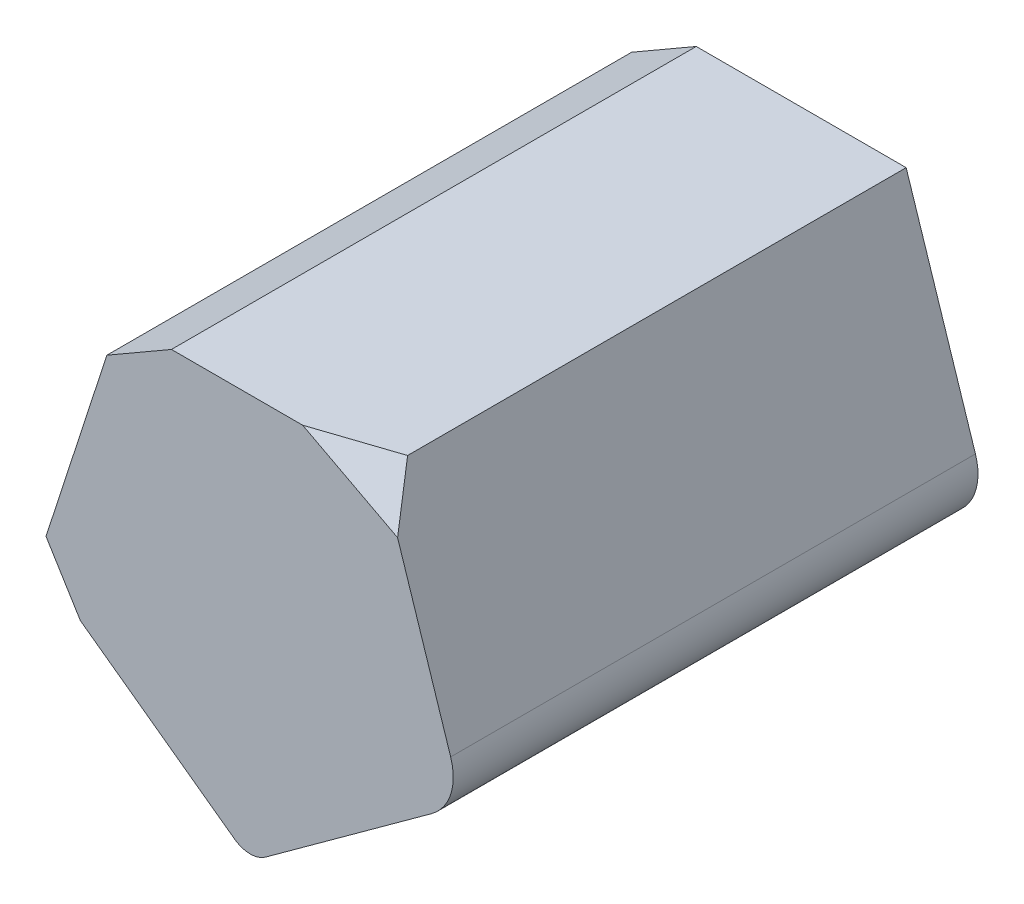
ISO-10303-21;
HEADER;
FILE_DESCRIPTION(('STEP AP214'),'2;1');
FILE_NAME('part.step','',(''),(''),'','','');
FILE_SCHEMA(('AUTOMOTIVE_DESIGN { 1 0 10303 214 1 1 1 1 }'));
ENDSEC;
DATA;
#1=APPLICATION_CONTEXT('core data for automotive mechanical design processes');
#2=APPLICATION_PROTOCOL_DEFINITION('international standard','automotive_design',2000,#1);
#3=PRODUCT_CONTEXT('',#1,'mechanical');
#4=PRODUCT('Part','Part','',(#3));
#5=PRODUCT_RELATED_PRODUCT_CATEGORY('part','',(#4));
#6=PRODUCT_DEFINITION_FORMATION('','',#4);
#7=PRODUCT_DEFINITION_CONTEXT('part definition',#1,'design');
#8=PRODUCT_DEFINITION('design','',#6,#7);
#9=PRODUCT_DEFINITION_SHAPE('','',#8);
#10=(LENGTH_UNIT() NAMED_UNIT(*) SI_UNIT(.MILLI.,.METRE.));
#11=(NAMED_UNIT(*) PLANE_ANGLE_UNIT() SI_UNIT($,.RADIAN.));
#12=(NAMED_UNIT(*) SI_UNIT($,.STERADIAN.) SOLID_ANGLE_UNIT());
#13=UNCERTAINTY_MEASURE_WITH_UNIT(LENGTH_MEASURE(1.E-05),#10,'distance_accuracy_value','');
#14=(GEOMETRIC_REPRESENTATION_CONTEXT(3) GLOBAL_UNCERTAINTY_ASSIGNED_CONTEXT((#13)) GLOBAL_UNIT_ASSIGNED_CONTEXT((#10,
#11,#12)) REPRESENTATION_CONTEXT('',''));
#15=CARTESIAN_POINT('',(0.,0.,0.));
#16=DIRECTION('',(0.,0.,1.));
#17=DIRECTION('',(1.,0.,0.));
#18=AXIS2_PLACEMENT_3D('',#15,#16,#17);
#19=CARTESIAN_POINT('',(11.907149248614,36.6464372171478,100.));
#20=DIRECTION('',(0.,-1.,0.));
#21=DIRECTION('',(1.,0.,0.));
#22=AXIS2_PLACEMENT_3D('',#19,#20,#21);
#23=PLANE('',#22);
#24=DIRECTION('',(-1.,0.,0.));
#25=VECTOR('',#24,1.);
#26=CARTESIAN_POINT('',(11.907149248614,36.6464372171478,100.));
#27=LINE('',#26,#25);
#28=CARTESIAN_POINT('',(-3.09285075138609,36.6464372171478,100.));
#29=VERTEX_POINT('',#28);
#30=CARTESIAN_POINT('',(-28.092850751386,36.6464372171478,100.));
#31=VERTEX_POINT('',#30);
#32=EDGE_CURVE('E142',#29,#31,#27,.T.);
#33=ORIENTED_EDGE('',*,*,#32,.F.);
#34=DIRECTION('',(0.948683298050514,0.,-0.316227766016838));
#35=VECTOR('',#34,1.);
#36=CARTESIAN_POINT('',(10.4071492486139,36.6464372171478,95.5));
#37=LINE('',#36,#35);
#38=CARTESIAN_POINT('',(11.907149248614,36.6464372171478,95.));
#39=VERTEX_POINT('',#38);
#40=EDGE_CURVE('E154',#29,#39,#37,.T.);
#41=ORIENTED_EDGE('',*,*,#40,.T.);
#42=DIRECTION('',(0.,0.,-1.));
#43=VECTOR('',#42,1.);
#44=CARTESIAN_POINT('',(11.907149248614,36.6464372171478,100.));
#45=LINE('',#44,#43);
#46=CARTESIAN_POINT('',(11.907149248614,36.6464372171478,0.));
#47=VERTEX_POINT('',#46);
#48=EDGE_CURVE('E150',#39,#47,#45,.T.);
#49=ORIENTED_EDGE('',*,*,#48,.T.);
#50=DIRECTION('',(-1.,0.,0.));
#51=VECTOR('',#50,1.);
#52=CARTESIAN_POINT('',(11.907149248614,36.6464372171478,0.));
#53=LINE('',#52,#51);
#54=CARTESIAN_POINT('',(-28.092850751386,36.6464372171478,0.));
#55=VERTEX_POINT('',#54);
#56=EDGE_CURVE('E241',#47,#55,#53,.T.);
#57=ORIENTED_EDGE('',*,*,#56,.T.);
#58=DIRECTION('',(0.,0.,1.));
#59=VECTOR('',#58,1.);
#60=CARTESIAN_POINT('',(-28.092850751386,36.6464372171478,100.));
#61=LINE('',#60,#59);
#62=EDGE_CURVE('E282',#55,#31,#61,.T.);
#63=ORIENTED_EDGE('',*,*,#62,.T.);
#64=EDGE_LOOP('',(#33,#41,#49,#57,#63));
#65=FACE_BOUND('',#64,.T.);
#66=ADVANCED_FACE('F44',(#65),#23,.F.);
#67=CARTESIAN_POINT('',(27.3579989673613,-10.9063885976098,100.));
#68=DIRECTION('',(-0.951056516295154,-0.309016994374948,0.));
#69=DIRECTION('',(0.309016994374948,-0.951056516295154,0.));
#70=AXIS2_PLACEMENT_3D('',#67,#68,#69);
#71=PLANE('',#70);
#72=DIRECTION('',(-0.309016994374948,0.951056516295154,0.));
#73=VECTOR('',#72,1.);
#74=CARTESIAN_POINT('',(27.3579989673613,-10.9063885976098,100.));
#75=LINE('',#74,#73);
#76=CARTESIAN_POINT('',(25.1128590844634,-3.9965585413593,100.));
#77=VERTEX_POINT('',#76);
#78=CARTESIAN_POINT('',(14.9973191923634,27.1358720541963,100.));
#79=VERTEX_POINT('',#78);
#80=EDGE_CURVE('E130',#77,#79,#75,.T.);
#81=ORIENTED_EDGE('',*,*,#80,.F.);
#82=DIRECTION('',(0.,0.,-1.));
#83=VECTOR('',#82,1.);
#84=CARTESIAN_POINT('',(25.1128590844634,-3.9965585413593,100.));
#85=LINE('',#84,#83);
#86=CARTESIAN_POINT('',(25.1128590844634,-3.9965585413593,0.));
#87=VERTEX_POINT('',#86);
#88=EDGE_CURVE('E159',#77,#87,#85,.T.);
#89=ORIENTED_EDGE('',*,*,#88,.T.);
#90=DIRECTION('',(-0.309016994374948,0.951056516295154,0.));
#91=VECTOR('',#90,1.);
#92=CARTESIAN_POINT('',(27.3579989673613,-10.9063885976098,0.));
#93=LINE('',#92,#91);
#94=EDGE_CURVE('E238',#87,#47,#93,.T.);
#95=ORIENTED_EDGE('',*,*,#94,.T.);
#96=ORIENTED_EDGE('',*,*,#48,.F.);
#97=DIRECTION('',(0.276393202250021,-0.85065080835204,0.447213595499958));
#98=VECTOR('',#97,1.);
#99=CARTESIAN_POINT('',(24.8858630123618,-3.2979364672486,116.));
#100=LINE('',#99,#98);
#101=EDGE_CURVE('E147',#39,#79,#100,.T.);
#102=ORIENTED_EDGE('',*,*,#101,.T.);
#103=EDGE_LOOP('',(#81,#89,#95,#96,#102));
#104=FACE_BOUND('',#103,.T.);
#105=ADVANCED_FACE('F148',(#104),#71,.F.);
#106=CARTESIAN_POINT('',(-38.092850751386,36.6464372171478,100.));
#107=DIRECTION('',(0.951056516295154,-0.309016994374947,0.));
#108=DIRECTION('',(0.309016994374947,0.951056516295154,0.));
#109=AXIS2_PLACEMENT_3D('',#106,#107,#108);
#110=PLANE('',#109);
#111=DIRECTION('',(-0.309016994374947,-0.951056516295154,0.));
#112=VECTOR('',#111,1.);
#113=CARTESIAN_POINT('',(-38.092850751386,36.6464372171478,100.));
#114=LINE('',#113,#112);
#115=CARTESIAN_POINT('',(-40.401944009401,29.5397789111527,100.));
#116=VERTEX_POINT('',#115);
#117=CARTESIAN_POINT('',(-51.9986154982587,-6.15110601613405,100.));
#118=VERTEX_POINT('',#117);
#119=EDGE_CURVE('E289',#116,#118,#114,.T.);
#120=ORIENTED_EDGE('',*,*,#119,.F.);
#121=DIRECTION('',(0.,0.,-1.));
#122=VECTOR('',#121,1.);
#123=CARTESIAN_POINT('',(-40.401944009401,29.5397789111527,100.));
#124=LINE('',#123,#122);
#125=CARTESIAN_POINT('',(-40.401944009401,29.5397789111527,0.));
#126=VERTEX_POINT('',#125);
#127=EDGE_CURVE('E275',#116,#126,#124,.T.);
#128=ORIENTED_EDGE('',*,*,#127,.T.);
#129=DIRECTION('',(-0.309016994374947,-0.951056516295154,0.));
#130=VECTOR('',#129,1.);
#131=CARTESIAN_POINT('',(-38.092850751386,36.6464372171478,0.));
#132=LINE('',#131,#130);
#133=CARTESIAN_POINT('',(-51.9986154982587,-6.15110601613405,0.));
#134=VERTEX_POINT('',#133);
#135=EDGE_CURVE('E245',#126,#134,#132,.T.);
#136=ORIENTED_EDGE('',*,*,#135,.T.);
#137=DIRECTION('',(0.,0.,1.));
#138=VECTOR('',#137,1.);
#139=CARTESIAN_POINT('',(-51.9986154982587,-6.15110601613406,100.));
#140=LINE('',#139,#138);
#141=EDGE_CURVE('E268',#134,#118,#140,.T.);
#142=ORIENTED_EDGE('',*,*,#141,.T.);
#143=EDGE_LOOP('',(#120,#128,#136,#142));
#144=FACE_BOUND('',#143,.T.);
#145=ADVANCED_FACE('F207',(#144),#110,.F.);
#146=CARTESIAN_POINT('',(-53.5437004701334,-10.9063885976098,100.));
#147=DIRECTION('',(0.587785252292473,0.809016994374948,0.));
#148=DIRECTION('',(-0.809016994374948,0.587785252292473,0.));
#149=AXIS2_PLACEMENT_3D('',#146,#147,#148);
#150=PLANE('',#149);
#151=DIRECTION('',(0.809016994374948,-0.587785252292473,0.));
#152=VECTOR('',#151,1.);
#153=CARTESIAN_POINT('',(-53.5437004701334,-10.9063885976098,0.));
#154=LINE('',#153,#152);
#155=CARTESIAN_POINT('',(-45.4535305263839,-16.7842411205346,0.));
#156=VERTEX_POINT('',#155);
#157=CARTESIAN_POINT('',(-18.9707032743108,-36.0251413809851,0.));
#158=VERTEX_POINT('',#157);
#159=EDGE_CURVE('E253',#156,#158,#154,.T.);
#160=ORIENTED_EDGE('',*,*,#159,.T.);
#161=CARTESIAN_POINT('',(-16.0317770128484,-38.1603962966093,300.));
#162=CARTESIAN_POINT('',(-16.0317770128484,-38.1603962966093,233.333333333333));
#163=CARTESIAN_POINT('',(-16.0317770128484,-38.1603962966093,166.666666666667));
#164=CARTESIAN_POINT('',(-16.0317770128484,-38.1603962966093,100.));
#165=CARTESIAN_POINT('',(-16.0317770128484,-38.1603962966093,88.8220450440059));
#166=CARTESIAN_POINT('',(-25.0521160659436,-31.606736357508,77.6440900880118));
#167=CARTESIAN_POINT('',(-25.0521160659436,-31.606736357508,66.4661351320177));
#168=CARTESIAN_POINT('',(-25.0521160659436,-31.606736357508,53.30406171571));
#169=CARTESIAN_POINT('',(-25.0521160659436,-31.606736357508,40.1419882994022));
#170=CARTESIAN_POINT('',(-25.0521160659436,-31.606736357508,26.9799148830945));
#171=CARTESIAN_POINT('',(-25.0521160659436,-31.606736357508,17.986609922063));
#172=CARTESIAN_POINT('',(-18.9707032743108,-36.0251413809851,8.9933049610315));
#173=CARTESIAN_POINT('',(-18.9707032743108,-36.0251413809851,0.));
#174=CARTESIAN_POINT('',(-18.9707032743108,-36.0251413809851,-66.6666666666667));
#175=CARTESIAN_POINT('',(-18.9707032743108,-36.0251413809851,-133.333333333333));
#176=CARTESIAN_POINT('',(-18.9707032743108,-36.0251413809851,-200.));
#177=(BOUNDED_CURVE() B_SPLINE_CURVE(3,(#161,#162,#163,#164,#165,#166,#167,#168,#169,#170,#171,
#172,#173,#174,#175,#176),.UNSPECIFIED.,.F.,.F.) B_SPLINE_CURVE_WITH_KNOTS((4,3,3,3,3,4),(-0.2,
0.,0.0335338648679823,0.0730200851169055,0.1,0.3),
.UNSPECIFIED.) CURVE() GEOMETRIC_REPRESENTATION_ITEM() RATIONAL_B_SPLINE_CURVE((1.,1.,1.,1.,1.,
1.,1.,1.,1.,1.,1.,1.,1.,1.,1.,1.)) REPRESENTATION_ITEM(''));
#178=CARTESIAN_POINT('',(-16.0317770128484,-38.1603962966093,100.));
#179=VERTEX_POINT('',#178);
#180=EDGE_CURVE('E62',#158,#179,#177,.F.);
#181=ORIENTED_EDGE('',*,*,#180,.T.);
#182=DIRECTION('',(0.809016994374948,-0.587785252292473,0.));
#183=VECTOR('',#182,1.);
#184=CARTESIAN_POINT('',(-53.5437004701334,-10.9063885976098,100.));
#185=LINE('',#184,#183);
#186=CARTESIAN_POINT('',(-45.4535305263839,-16.7842411205346,100.));
#187=VERTEX_POINT('',#186);
#188=EDGE_CURVE('E296',#187,#179,#185,.T.);
#189=ORIENTED_EDGE('',*,*,#188,.F.);
#190=DIRECTION('',(0.,0.,-1.));
#191=VECTOR('',#190,1.);
#192=CARTESIAN_POINT('',(-45.4535305263839,-16.7842411205346,100.));
#193=LINE('',#192,#191);
#194=EDGE_CURVE('E260',#187,#156,#193,.T.);
#195=ORIENTED_EDGE('',*,*,#194,.T.);
#196=EDGE_LOOP('',(#160,#181,#189,#195));
#197=FACE_BOUND('',#196,.T.);
#198=ADVANCED_FACE('F203',(#197),#150,.F.);
#199=CARTESIAN_POINT('',(-13.092850751386,-40.2956512122335,100.));
#200=DIRECTION('',(-0.587785252292473,0.809016994374948,0.));
#201=DIRECTION('',(-0.809016994374948,-0.587785252292473,0.));
#202=AXIS2_PLACEMENT_3D('',#199,#200,#201);
#203=PLANE('',#202);
#204=DIRECTION('',(0.809016994374947,0.587785252292473,0.));
#205=VECTOR('',#204,1.);
#206=CARTESIAN_POINT('',(-13.092850751386,-40.2956512122335,100.));
#207=LINE('',#206,#205);
#208=CARTESIAN_POINT('',(-10.1539244899237,-38.1603962966093,100.));
#209=VERTEX_POINT('',#208);
#210=CARTESIAN_POINT('',(21.4801464444366,-15.1768984288582,100.));
#211=VERTEX_POINT('',#210);
#212=EDGE_CURVE('E248',#209,#211,#207,.T.);
#213=ORIENTED_EDGE('',*,*,#212,.F.);
#214=CARTESIAN_POINT('',(-10.1539244899237,-38.1603962966093,300.));
#215=CARTESIAN_POINT('',(-10.1539244899237,-38.1603962966093,233.333333333333));
#216=CARTESIAN_POINT('',(-10.1539244899237,-38.1603962966093,166.666666666667));
#217=CARTESIAN_POINT('',(-10.1539244899237,-38.1603962966093,100.));
#218=CARTESIAN_POINT('',(-10.1539244899237,-38.1603962966093,88.8220450440059));
#219=CARTESIAN_POINT('',(-1.13358543682849,-31.606736357508,77.6440900880118));
#220=CARTESIAN_POINT('',(-1.13358543682849,-31.606736357508,66.4661351320177));
#221=CARTESIAN_POINT('',(-1.13358543682849,-31.606736357508,53.30406171571));
#222=CARTESIAN_POINT('',(-1.13358543682849,-31.606736357508,40.1419882994022));
#223=CARTESIAN_POINT('',(-1.13358543682849,-31.606736357508,26.9799148830945));
#224=CARTESIAN_POINT('',(-1.13358543682849,-31.606736357508,17.986609922063));
#225=CARTESIAN_POINT('',(-7.21499822846131,-36.0251413809851,8.9933049610315));
#226=CARTESIAN_POINT('',(-7.21499822846131,-36.0251413809851,0.));
#227=CARTESIAN_POINT('',(-7.21499822846131,-36.0251413809851,-66.6666666666667));
#228=CARTESIAN_POINT('',(-7.21499822846131,-36.0251413809851,-133.333333333333));
#229=CARTESIAN_POINT('',(-7.21499822846131,-36.0251413809851,-200.));
#230=(BOUNDED_CURVE() B_SPLINE_CURVE(3,(#214,#215,#216,#217,#218,#219,#220,#221,#222,#223,#224,
#225,#226,#227,#228,#229),.UNSPECIFIED.,.F.,.F.) B_SPLINE_CURVE_WITH_KNOTS((4,3,3,3,3,4),(-0.2,
0.,0.0335338648679823,0.0730200851169055,0.1,0.3),
.UNSPECIFIED.) CURVE() GEOMETRIC_REPRESENTATION_ITEM() RATIONAL_B_SPLINE_CURVE((1.,1.,1.,1.,1.,
1.,1.,1.,1.,1.,1.,1.,1.,1.,1.,1.)) REPRESENTATION_ITEM(''));
#231=CARTESIAN_POINT('',(-7.21499822846131,-36.0251413809851,0.));
#232=VERTEX_POINT('',#231);
#233=EDGE_CURVE('E176',#209,#232,#230,.T.);
#234=ORIENTED_EDGE('',*,*,#233,.T.);
#235=DIRECTION('',(0.809016994374947,0.587785252292473,0.));
#236=VECTOR('',#235,1.);
#237=CARTESIAN_POINT('',(-13.092850751386,-40.2956512122335,0.));
#238=LINE('',#237,#236);
#239=CARTESIAN_POINT('',(21.4801464444366,-15.1768984288582,0.));
#240=VERTEX_POINT('',#239);
#241=EDGE_CURVE('E143',#232,#240,#238,.T.);
#242=ORIENTED_EDGE('',*,*,#241,.T.);
#243=DIRECTION('',(0.,0.,-1.));
#244=VECTOR('',#243,1.);
#245=CARTESIAN_POINT('',(21.4801464444366,-15.1768984288583,100.));
#246=LINE('',#245,#244);
#247=EDGE_CURVE('E170',#240,#211,#246,.F.);
#248=ORIENTED_EDGE('',*,*,#247,.T.);
#249=EDGE_LOOP('',(#213,#234,#242,#248));
#250=FACE_BOUND('',#249,.T.);
#251=ADVANCED_FACE('F200',(#250),#203,.F.);
#252=CARTESIAN_POINT('',(11.907149248614,36.6464372171478,100.));
#253=DIRECTION('',(0.,0.,1.));
#254=DIRECTION('',(1.,0.,0.));
#255=AXIS2_PLACEMENT_3D('',#252,#253,#254);
#256=PLANE('',#255);
#257=ORIENTED_EDGE('',*,*,#188,.T.);
#258=CARTESIAN_POINT('',(-16.0317770128484,-38.1603962966093,100.));
#259=CARTESIAN_POINT('',(-15.9180236725017,-38.2430616193592,100.));
#260=CARTESIAN_POINT('',(-15.8007679502604,-38.3209026171481,100.));
#261=CARTESIAN_POINT('',(-15.5601260461243,-38.4664356789878,100.));
#262=CARTESIAN_POINT('',(-15.4367401520899,-38.5341282189908,100.));
#263=CARTESIAN_POINT('',(-15.184774435152,-38.6588357693077,100.));
#264=CARTESIAN_POINT('',(-15.0561976650311,-38.7158569474274,100.));
#265=CARTESIAN_POINT('',(-14.7947008901455,-38.8188685909356,100.));
#266=CARTESIAN_POINT('',(-14.661780941855,-38.8648591996893,100.));
#267=CARTESIAN_POINT('',(-14.3925094029495,-38.9454919457617,100.));
#268=CARTESIAN_POINT('',(-14.2561570402803,-38.9801315048751,100.));
#269=CARTESIAN_POINT('',(-13.9809678357072,-39.0378126446984,100.));
#270=CARTESIAN_POINT('',(-13.8421300882371,-39.0608499051482,100.));
#271=CARTESIAN_POINT('',(-13.5630864463132,-39.0951333470199,100.));
#272=CARTESIAN_POINT('',(-13.4228813734173,-39.1063862157062,100.));
#273=CARTESIAN_POINT('',(-13.1419713913629,-39.1170460648508,100.));
#274=CARTESIAN_POINT('',(-13.0012663212429,-39.116448803352,100.));
#275=CARTESIAN_POINT('',(-12.7204335289857,-39.1034031691143,100.));
#276=CARTESIAN_POINT('',(-12.5803057004813,-39.0909570877468,100.));
#277=CARTESIAN_POINT('',(-12.3015402678955,-39.0542992287101,100.));
#278=CARTESIAN_POINT('',(-12.1629033044064,-39.0300825849422,100.));
#279=CARTESIAN_POINT('',(-11.8882254824226,-38.9700640719507,100.));
#280=CARTESIAN_POINT('',(-11.7521833682495,-38.9342679649548,100.));
#281=CARTESIAN_POINT('',(-11.4835908164211,-38.8513496518921,100.));
#282=CARTESIAN_POINT('',(-11.3510411412768,-38.8042249948086,99.9999999999999));
#283=CARTESIAN_POINT('',(-11.0316122455256,-38.6752241609149,99.9999999999999));
#284=CARTESIAN_POINT('',(-10.8471359456854,-38.5872537122504,100.));
#285=CARTESIAN_POINT('',(-10.5797643072397,-38.4390590508643,100.));
#286=CARTESIAN_POINT('',(-10.4922402114322,-38.3869853046635,100.));
#287=CARTESIAN_POINT('',(-10.3205177951635,-38.2775853042953,100.));
#288=CARTESIAN_POINT('',(-10.2363200387709,-38.2202581647014,100.));
#289=CARTESIAN_POINT('',(-10.1539244899237,-38.1603962966093,100.));
#290=B_SPLINE_CURVE_WITH_KNOTS('',3,(#258,#259,#260,#261,#262,#263,#264,#265,#266,#267,#268,
#269,#270,#271,#272,#273,#274,#275,#276,#277,#278,#279,#280,#281,#282,#283,#284,#285,#286,#287,
#288,#289),.UNSPECIFIED.,.F.,.F.,(4,2,2,2,2,2,2,2,2,2,2,2,2,2,2,4),(0.,0.421724770421648,
0.843429756189753,1.26489024813724,1.68634526203059,2.10789593629354,2.52960346435021,
2.95107155702082,3.37269052413577,3.79422797347477,4.21593984011815,4.63744217448715,
5.05903578625306,5.67041079518687,5.97578411534686,6.28120899926126),.UNSPECIFIED.);
#291=EDGE_CURVE('E12',#179,#209,#290,.T.);
#292=ORIENTED_EDGE('',*,*,#291,.T.);
#293=ORIENTED_EDGE('',*,*,#212,.T.);
#294=CARTESIAN_POINT('',(15.6022939215119,-7.08672848510878,100.));
#295=DIRECTION('',(0.,0.,1.));
#296=DIRECTION('',(1.,0.,0.));
#297=AXIS2_PLACEMENT_3D('',#294,#295,#296);
#298=CIRCLE('',#297,10.);
#299=EDGE_CURVE('E137',#211,#77,#298,.T.);
#300=ORIENTED_EDGE('',*,*,#299,.T.);
#301=ORIENTED_EDGE('',*,*,#80,.T.);
#302=DIRECTION('',(0.885131422637847,-0.465341127194986,0.));
#303=VECTOR('',#302,1.);
#304=CARTESIAN_POINT('',(8.65901377872744,30.4681164082579,100.));
#305=LINE('',#304,#303);
#306=EDGE_CURVE('E134',#29,#79,#305,.T.);
#307=ORIENTED_EDGE('',*,*,#306,.F.);
#308=ORIENTED_EDGE('',*,*,#32,.T.);
#309=DIRECTION('',(0.86602540378444,0.499999999999997,0.));
#310=VECTOR('',#309,1.);
#311=CARTESIAN_POINT('',(1.90714924861408,53.9669452928365,100.));
#312=LINE('',#311,#310);
#313=EDGE_CURVE('E155',#31,#116,#312,.F.);
#314=ORIENTED_EDGE('',*,*,#313,.T.);
#315=ORIENTED_EDGE('',*,*,#119,.T.);
#316=DIRECTION('',(-0.52419136737519,0.851600499277289,0.));
#317=VECTOR('',#316,1.);
#318=CARTESIAN_POINT('',(-53.5437004701333,-3.64096331755635,100.));
#319=LINE('',#318,#317);
#320=EDGE_CURVE('E272',#118,#187,#319,.F.);
#321=ORIENTED_EDGE('',*,*,#320,.T.);
#322=EDGE_LOOP('',(#257,#292,#293,#300,#301,#307,#308,#314,#315,#321));
#323=FACE_BOUND('',#322,.T.);
#324=ADVANCED_FACE('F132',(#323),#256,.T.);
#325=CARTESIAN_POINT('',(11.907149248614,36.6464372171478,0.));
#326=DIRECTION('',(0.,0.,1.));
#327=DIRECTION('',(1.,0.,0.));
#328=AXIS2_PLACEMENT_3D('',#325,#326,#327);
#329=PLANE('',#328);
#330=ORIENTED_EDGE('',*,*,#241,.F.);
#331=CARTESIAN_POINT('',(-7.21499822846131,-36.0251413809851,0.));
#332=CARTESIAN_POINT('',(-7.44250491109566,-36.1904720267671,0.));
#333=CARTESIAN_POINT('',(-7.6770163546078,-36.3461540222039,0.));
#334=CARTESIAN_POINT('',(-8.15830016093907,-36.637220145601,0.));
#335=CARTESIAN_POINT('',(-8.40507194803744,-36.7726052254659,0.));
#336=CARTESIAN_POINT('',(-8.90900338579377,-37.0220203266639,0.));
#337=CARTESIAN_POINT('',(-9.16615693088325,-37.1360626836084,0.));
#338=CARTESIAN_POINT('',(-9.68915046707994,-37.3420859686506,0.));
#339=CARTESIAN_POINT('',(-9.95499034523913,-37.4340671834789,0.));
#340=CARTESIAN_POINT('',(-10.493580711114,-37.5953468281596,0.));
#341=CARTESIAN_POINT('',(-10.7663339367726,-37.6646361150216,0.));
#342=CARTESIAN_POINT('',(-11.3167140370621,-37.7799902568015,0.));
#343=CARTESIAN_POINT('',(-11.5943410152261,-37.8260546177334,0.));
#344=CARTESIAN_POINT('',(-12.1524316266413,-37.894621895946,0.));
#345=CARTESIAN_POINT('',(-12.4328946660086,-37.917129646992,0.));
#346=CARTESIAN_POINT('',(-12.9947149628864,-37.938440480852,0.));
#347=CARTESIAN_POINT('',(-13.2760722053863,-37.9372439595043,0.));
#348=CARTESIAN_POINT('',(-13.8377447855383,-37.9111523496765,0.));
#349=CARTESIAN_POINT('',(-14.1180598964782,-37.8862523764744,0.));
#350=CARTESIAN_POINT('',(-14.6755894506126,-37.81292669209,0.));
#351=CARTESIAN_POINT('',(-14.9528039267282,-37.7645012309325,0.));
#352=CARTESIAN_POINT('',(-15.5021575685713,-37.6444646262994,0.));
#353=CARTESIAN_POINT('',(-15.7742971380918,-37.5728553358781,0.));
#354=CARTESIAN_POINT('',(-16.3114793931481,-37.4070094283758,0.));
#355=CARTESIAN_POINT('',(-16.5765234405592,-37.3127771885332,0.));
#356=CARTESIAN_POINT('',(-17.2153277073617,-37.0547971255835,0.));
#357=CARTESIAN_POINT('',(-17.5842803529895,-36.8788562146558,0.));
#358=CARTESIAN_POINT('',(-18.119021584445,-36.5824680301582,0.));
#359=CARTESIAN_POINT('',(-18.2940677829908,-36.4783218065579,0.));
#360=CARTESIAN_POINT('',(-18.6375127634964,-36.2595220506092,0.));
#361=CARTESIAN_POINT('',(-18.8059102627784,-36.14486650482,0.));
#362=CARTESIAN_POINT('',(-18.9707032743108,-36.0251413809851,0.));
#363=B_SPLINE_CURVE_WITH_KNOTS('',3,(#331,#332,#333,#334,#335,#336,#337,#338,#339,#340,#341,
#342,#343,#344,#345,#346,#347,#348,#349,#350,#351,#352,#353,#354,#355,#356,#357,#358,#359,#360,
#361,#362),.UNSPECIFIED.,.F.,.F.,(4,2,2,2,2,2,2,2,2,2,2,2,2,2,2,4),(0.,0.843449540843285,
1.68685951237949,2.52978049627445,3.37269052406115,4.21593975897657,5.05920692875215,
5.90230102798466,6.74538104837121,7.58863484526475,8.43187968040017,9.27505713267237,
10.1180715726736,11.3408215905412,11.951561167216,12.5624179986888),.UNSPECIFIED.);
#364=EDGE_CURVE('E76',#232,#158,#363,.T.);
#365=ORIENTED_EDGE('',*,*,#364,.T.);
#366=ORIENTED_EDGE('',*,*,#159,.F.);
#367=DIRECTION('',(0.52419136737519,-0.851600499277289,0.));
#368=VECTOR('',#367,1.);
#369=CARTESIAN_POINT('',(-45.4535305263839,-16.7842411205346,0.));
#370=LINE('',#369,#368);
#371=EDGE_CURVE('E264',#156,#134,#370,.F.);
#372=ORIENTED_EDGE('',*,*,#371,.T.);
#373=ORIENTED_EDGE('',*,*,#135,.F.);
#374=DIRECTION('',(-0.86602540378444,-0.499999999999997,0.));
#375=VECTOR('',#374,1.);
#376=CARTESIAN_POINT('',(-40.4019440094011,29.5397789111527,0.));
#377=LINE('',#376,#375);
#378=EDGE_CURVE('E279',#126,#55,#377,.F.);
#379=ORIENTED_EDGE('',*,*,#378,.T.);
#380=ORIENTED_EDGE('',*,*,#56,.F.);
#381=ORIENTED_EDGE('',*,*,#94,.F.);
#382=CARTESIAN_POINT('',(15.6022939215119,-7.08672848510878,0.));
#383=DIRECTION('',(0.,0.,1.));
#384=DIRECTION('',(1.,0.,0.));
#385=AXIS2_PLACEMENT_3D('',#382,#383,#384);
#386=CIRCLE('',#385,10.);
#387=EDGE_CURVE('E163',#87,#240,#386,.F.);
#388=ORIENTED_EDGE('',*,*,#387,.T.);
#389=EDGE_LOOP('',(#330,#365,#366,#372,#373,#379,#380,#381,#388));
#390=FACE_BOUND('',#389,.T.);
#391=ADVANCED_FACE('F193',(#390),#329,.F.);
#392=CARTESIAN_POINT('',(-45.4535305263839,-16.7842411205346,100.));
#393=DIRECTION('',(0.851600499277289,0.52419136737519,0.));
#394=DIRECTION('',(0.,0.,-1.));
#395=AXIS2_PLACEMENT_3D('',#392,#393,#394);
#396=PLANE('',#395);
#397=ORIENTED_EDGE('',*,*,#320,.F.);
#398=ORIENTED_EDGE('',*,*,#141,.F.);
#399=ORIENTED_EDGE('',*,*,#371,.F.);
#400=ORIENTED_EDGE('',*,*,#194,.F.);
#401=EDGE_LOOP('',(#397,#398,#399,#400));
#402=FACE_BOUND('',#401,.T.);
#403=ADVANCED_FACE('F197',(#402),#396,.F.);
#404=CARTESIAN_POINT('',(-40.4019440094011,29.5397789111527,100.));
#405=DIRECTION('',(0.499999999999997,-0.86602540378444,0.));
#406=DIRECTION('',(0.,0.,-1.));
#407=AXIS2_PLACEMENT_3D('',#404,#405,#406);
#408=PLANE('',#407);
#409=ORIENTED_EDGE('',*,*,#313,.F.);
#410=ORIENTED_EDGE('',*,*,#62,.F.);
#411=ORIENTED_EDGE('',*,*,#378,.F.);
#412=ORIENTED_EDGE('',*,*,#127,.F.);
#413=EDGE_LOOP('',(#409,#410,#411,#412));
#414=FACE_BOUND('',#413,.T.);
#415=ADVANCED_FACE('F222',(#414),#408,.F.);
#416=CARTESIAN_POINT('',(26.9211264548333,51.2070254817501,80.7633793644998));
#417=DIRECTION('',(-0.270983465883546,-0.515441182073583,-0.812950397650637));
#418=DIRECTION('',(0.,0.844550081681107,-0.535476572346947));
#419=AXIS2_PLACEMENT_3D('',#416,#417,#418);
#420=PLANE('',#419);
#421=ORIENTED_EDGE('',*,*,#101,.F.);
#422=ORIENTED_EDGE('',*,*,#40,.F.);
#423=ORIENTED_EDGE('',*,*,#306,.T.);
#424=EDGE_LOOP('',(#421,#422,#423));
#425=FACE_BOUND('',#424,.T.);
#426=ADVANCED_FACE('F157',(#425),#420,.F.);
#427=CARTESIAN_POINT('',(15.6022939215119,-7.08672848510878,100.));
#428=DIRECTION('',(0.,0.,-1.));
#429=DIRECTION('',(-1.,0.,0.));
#430=AXIS2_PLACEMENT_3D('',#427,#428,#429);
#431=CYLINDRICAL_SURFACE('',#430,10.);
#432=ORIENTED_EDGE('',*,*,#299,.F.);
#433=ORIENTED_EDGE('',*,*,#247,.F.);
#434=ORIENTED_EDGE('',*,*,#387,.F.);
#435=ORIENTED_EDGE('',*,*,#88,.F.);
#436=EDGE_LOOP('',(#432,#433,#434,#435));
#437=FACE_BOUND('',#436,.T.);
#438=ADVANCED_FACE('F228',(#437),#431,.T.);
#439=CARTESIAN_POINT('',(-10.1539244899237,-38.1603962966093,120.));
#440=CARTESIAN_POINT('',(-10.1539244899237,-38.1603962966093,113.333333333333));
#441=CARTESIAN_POINT('',(-10.1539244899237,-38.1603962966093,106.666666666667));
#442=CARTESIAN_POINT('',(-10.1539244899237,-38.1603962966093,100.));
#443=CARTESIAN_POINT('',(-10.1539244899237,-38.1603962966093,88.8220450440059));
#444=CARTESIAN_POINT('',(-1.13358543682849,-31.606736357508,77.6440900880118));
#445=CARTESIAN_POINT('',(-1.13358543682849,-31.606736357508,66.4661351320177));
#446=CARTESIAN_POINT('',(-1.13358543682849,-31.606736357508,53.30406171571));
#447=CARTESIAN_POINT('',(-1.13358543682849,-31.606736357508,40.1419882994022));
#448=CARTESIAN_POINT('',(-1.13358543682849,-31.606736357508,26.9799148830945));
#449=CARTESIAN_POINT('',(-1.13358543682849,-31.606736357508,17.986609922063));
#450=CARTESIAN_POINT('',(-7.21499822846131,-36.0251413809851,8.9933049610315));
#451=CARTESIAN_POINT('',(-7.21499822846131,-36.0251413809851,0.));
#452=CARTESIAN_POINT('',(-7.21499822846131,-36.0251413809851,-6.66666666666668));
#453=CARTESIAN_POINT('',(-7.21499822846131,-36.0251413809851,-13.3333333333334));
#454=CARTESIAN_POINT('',(-7.21499822846131,-36.0251413809851,-20.));
#455=CARTESIAN_POINT('',(-13.092850751386,-40.2956512122335,120.));
#456=CARTESIAN_POINT('',(-13.092850751386,-40.2956512122335,113.333333333333));
#457=CARTESIAN_POINT('',(-13.092850751386,-40.2956512122335,106.666666666667));
#458=CARTESIAN_POINT('',(-13.092850751386,-40.2956512122335,100.));
#459=CARTESIAN_POINT('',(-13.092850751386,-40.2956512122335,88.8220450440059));
#460=CARTESIAN_POINT('',(-13.092850751386,-40.2956512122335,77.6440900880118));
#461=CARTESIAN_POINT('',(-13.092850751386,-40.2956512122335,66.4661351320177));
#462=CARTESIAN_POINT('',(-13.092850751386,-40.2956512122335,53.30406171571));
#463=CARTESIAN_POINT('',(-13.092850751386,-40.2956512122335,40.1419882994022));
#464=CARTESIAN_POINT('',(-13.092850751386,-40.2956512122335,26.9799148830945));
#465=CARTESIAN_POINT('',(-13.092850751386,-40.2956512122335,17.986609922063));
#466=CARTESIAN_POINT('',(-13.092850751386,-40.2956512122335,8.9933049610315));
#467=CARTESIAN_POINT('',(-13.092850751386,-40.2956512122335,0.));
#468=CARTESIAN_POINT('',(-13.092850751386,-40.2956512122335,-6.66666666666668));
#469=CARTESIAN_POINT('',(-13.092850751386,-40.2956512122335,-13.3333333333334));
#470=CARTESIAN_POINT('',(-13.092850751386,-40.2956512122335,-20.));
#471=CARTESIAN_POINT('',(-16.0317770128484,-38.1603962966093,120.));
#472=CARTESIAN_POINT('',(-16.0317770128484,-38.1603962966093,113.333333333333));
#473=CARTESIAN_POINT('',(-16.0317770128484,-38.1603962966093,106.666666666667));
#474=CARTESIAN_POINT('',(-16.0317770128484,-38.1603962966093,100.));
#475=CARTESIAN_POINT('',(-16.0317770128484,-38.1603962966093,88.8220450440059));
#476=CARTESIAN_POINT('',(-25.0521160659436,-31.606736357508,77.6440900880118));
#477=CARTESIAN_POINT('',(-25.0521160659436,-31.606736357508,66.4661351320177));
#478=CARTESIAN_POINT('',(-25.0521160659436,-31.606736357508,53.30406171571));
#479=CARTESIAN_POINT('',(-25.0521160659436,-31.606736357508,40.1419882994022));
#480=CARTESIAN_POINT('',(-25.0521160659436,-31.606736357508,26.9799148830945));
#481=CARTESIAN_POINT('',(-25.0521160659436,-31.606736357508,17.986609922063));
#482=CARTESIAN_POINT('',(-18.9707032743108,-36.0251413809851,8.9933049610315));
#483=CARTESIAN_POINT('',(-18.9707032743108,-36.0251413809851,0.));
#484=CARTESIAN_POINT('',(-18.9707032743108,-36.0251413809851,-6.66666666666668));
#485=CARTESIAN_POINT('',(-18.9707032743108,-36.0251413809851,-13.3333333333334));
#486=CARTESIAN_POINT('',(-18.9707032743108,-36.0251413809851,-20.));
#487=(BOUNDED_SURFACE() B_SPLINE_SURFACE(2,3,((#439,#440,#441,#442,#443,#444,#445,#446,#447,
#448,#449,#450,#451,#452,#453,#454),(#455,#456,#457,#458,#459,#460,#461,#462,#463,#464,#465,
#466,#467,#468,#469,#470),(#471,#472,#473,#474,#475,#476,#477,#478,#479,#480,#481,#482,#483,
#484,#485,#486)),.UNSPECIFIED.,.F.,.F.,.F.) B_SPLINE_SURFACE_WITH_KNOTS((3,3),(4,3,3,3,3,4),(0.,
1.),(-0.0200000000000001,0.,0.0335338648679823,0.0730200851169055,0.1,0.12),
.UNSPECIFIED.) GEOMETRIC_REPRESENTATION_ITEM() RATIONAL_B_SPLINE_SURFACE(((1.,1.,1.,1.,1.,1.,1.,
1.,1.,1.,1.,1.,1.,1.,1.,1.),(0.809016994374948,0.809016994374948,0.809016994374948,
0.809016994374948,0.809016994374948,0.809016994374948,0.809016994374948,0.809016994374948,
0.809016994374948,0.809016994374948,0.809016994374948,0.809016994374948,0.809016994374948,
0.809016994374948,0.809016994374948,0.809016994374948),(1.,1.,1.,1.,1.,1.,1.,1.,1.,1.,1.,1.,1.,
1.,1.,1.))) REPRESENTATION_ITEM('') SURFACE());
#488=ORIENTED_EDGE('',*,*,#291,.F.);
#489=ORIENTED_EDGE('',*,*,#180,.F.);
#490=ORIENTED_EDGE('',*,*,#364,.F.);
#491=ORIENTED_EDGE('',*,*,#233,.F.);
#492=EDGE_LOOP('',(#488,#489,#490,#491));
#493=FACE_BOUND('',#492,.T.);
#494=ADVANCED_FACE('F47',(#493),#487,.T.);
#495=CLOSED_SHELL('',(#66,#105,#145,#198,#251,#324,#391,#403,#415,#426,#438,#494));
#496=MANIFOLD_SOLID_BREP('B2',#495);
#497=ADVANCED_BREP_SHAPE_REPRESENTATION('',(#18,#496),#14);
#498=SHAPE_DEFINITION_REPRESENTATION(#9,#497);
ENDSEC;
END-ISO-10303-21;
